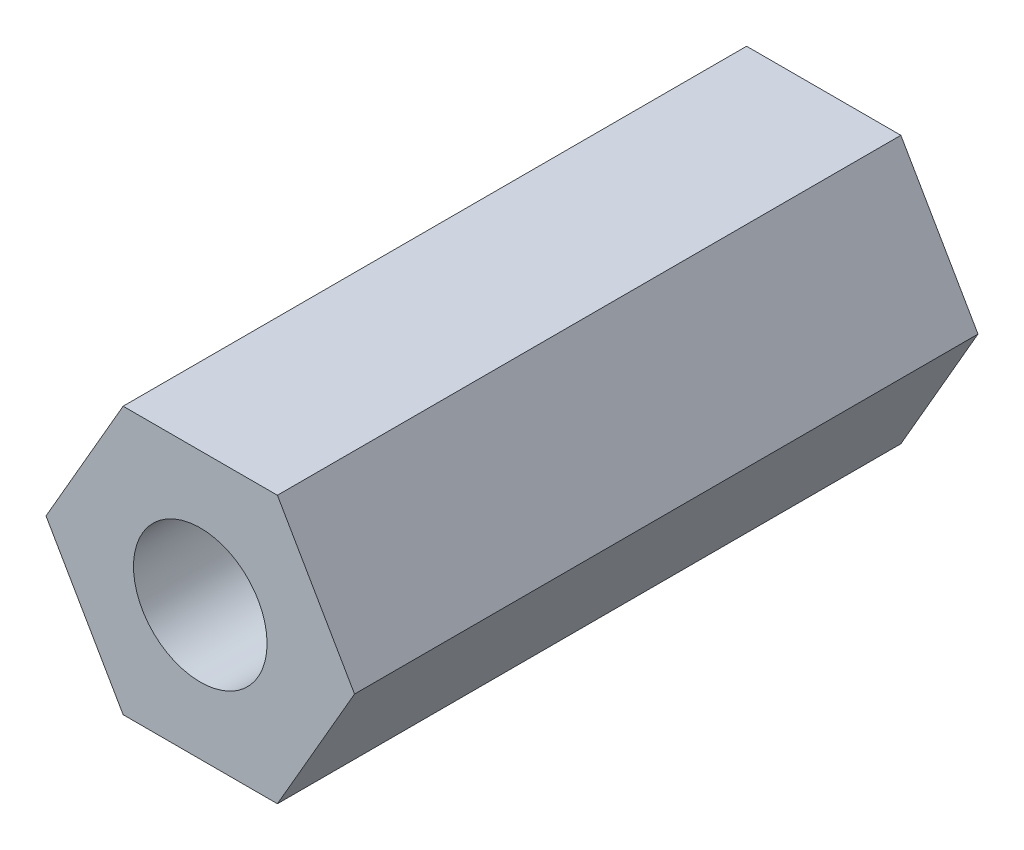
ISO-10303-21;
HEADER;
FILE_DESCRIPTION(('STEP AP214'),'2;1');
FILE_NAME('part.step','',(''),(''),'','','');
FILE_SCHEMA(('AUTOMOTIVE_DESIGN { 1 0 10303 214 1 1 1 1 }'));
ENDSEC;
DATA;
#1=APPLICATION_CONTEXT('core data for automotive mechanical design processes');
#2=APPLICATION_PROTOCOL_DEFINITION('international standard','automotive_design',2000,#1);
#3=PRODUCT_CONTEXT('',#1,'mechanical');
#4=PRODUCT('Part','Part','',(#3));
#5=PRODUCT_RELATED_PRODUCT_CATEGORY('part','',(#4));
#6=PRODUCT_DEFINITION_FORMATION('','',#4);
#7=PRODUCT_DEFINITION_CONTEXT('part definition',#1,'design');
#8=PRODUCT_DEFINITION('design','',#6,#7);
#9=PRODUCT_DEFINITION_SHAPE('','',#8);
#10=(LENGTH_UNIT() NAMED_UNIT(*) SI_UNIT(.MILLI.,.METRE.));
#11=(NAMED_UNIT(*) PLANE_ANGLE_UNIT() SI_UNIT($,.RADIAN.));
#12=(NAMED_UNIT(*) SI_UNIT($,.STERADIAN.) SOLID_ANGLE_UNIT());
#13=UNCERTAINTY_MEASURE_WITH_UNIT(LENGTH_MEASURE(1.E-05),#10,'distance_accuracy_value','');
#14=(GEOMETRIC_REPRESENTATION_CONTEXT(3) GLOBAL_UNCERTAINTY_ASSIGNED_CONTEXT((#13)) GLOBAL_UNIT_ASSIGNED_CONTEXT((#10,
#11,#12)) REPRESENTATION_CONTEXT('',''));
#15=CARTESIAN_POINT('',(0.,0.,0.));
#16=DIRECTION('',(0.,0.,1.));
#17=DIRECTION('',(1.,0.,0.));
#18=AXIS2_PLACEMENT_3D('',#15,#16,#17);
#19=CARTESIAN_POINT('',(-1.73205080756888,-3.,13.));
#20=DIRECTION('',(0.866025403784438,-0.5,0.));
#21=DIRECTION('',(0.5,0.866025403784439,0.));
#22=AXIS2_PLACEMENT_3D('',#19,#20,#21);
#23=PLANE('',#22);
#24=DIRECTION('',(0.,0.,-1.));
#25=VECTOR('',#24,1.);
#26=CARTESIAN_POINT('',(0.,0.,13.));
#27=LINE('',#26,#25);
#28=CARTESIAN_POINT('',(0.,0.,13.));
#29=VERTEX_POINT('',#28);
#30=CARTESIAN_POINT('',(0.,0.,-1.));
#31=VERTEX_POINT('',#30);
#32=EDGE_CURVE('E104',#29,#31,#27,.T.);
#33=ORIENTED_EDGE('',*,*,#32,.T.);
#34=DIRECTION('',(-0.5,-0.866025403784439,0.));
#35=VECTOR('',#34,1.);
#36=CARTESIAN_POINT('',(-1.73205080756888,-3.,-1.));
#37=LINE('',#36,#35);
#38=CARTESIAN_POINT('',(-1.73205080756888,-3.,-1.));
#39=VERTEX_POINT('',#38);
#40=EDGE_CURVE('E98',#31,#39,#37,.T.);
#41=ORIENTED_EDGE('',*,*,#40,.T.);
#42=DIRECTION('',(0.,0.,-1.));
#43=VECTOR('',#42,1.);
#44=CARTESIAN_POINT('',(-1.73205080756888,-3.,13.));
#45=LINE('',#44,#43);
#46=CARTESIAN_POINT('',(-1.73205080756888,-3.,13.));
#47=VERTEX_POINT('',#46);
#48=EDGE_CURVE('E11',#47,#39,#45,.T.);
#49=ORIENTED_EDGE('',*,*,#48,.F.);
#50=DIRECTION('',(-0.5,-0.866025403784439,0.));
#51=VECTOR('',#50,1.);
#52=CARTESIAN_POINT('',(-1.73205080756888,-3.,13.));
#53=LINE('',#52,#51);
#54=EDGE_CURVE('E122',#29,#47,#53,.T.);
#55=ORIENTED_EDGE('',*,*,#54,.F.);
#56=EDGE_LOOP('',(#33,#41,#49,#55));
#57=FACE_BOUND('',#56,.T.);
#58=ADVANCED_FACE('F34',(#57),#23,.F.);
#59=CARTESIAN_POINT('',(0.,-6.,13.));
#60=DIRECTION('',(0.866025403784439,0.5,0.));
#61=DIRECTION('',(-0.5,0.866025403784439,0.));
#62=AXIS2_PLACEMENT_3D('',#59,#60,#61);
#63=PLANE('',#62);
#64=ORIENTED_EDGE('',*,*,#48,.T.);
#65=DIRECTION('',(0.5,-0.866025403784439,0.));
#66=VECTOR('',#65,1.);
#67=CARTESIAN_POINT('',(0.,-6.,-1.));
#68=LINE('',#67,#66);
#69=CARTESIAN_POINT('',(0.,-6.,-1.));
#70=VERTEX_POINT('',#69);
#71=EDGE_CURVE('E88',#39,#70,#68,.T.);
#72=ORIENTED_EDGE('',*,*,#71,.T.);
#73=DIRECTION('',(0.,0.,-1.));
#74=VECTOR('',#73,1.);
#75=CARTESIAN_POINT('',(0.,-6.,13.));
#76=LINE('',#75,#74);
#77=CARTESIAN_POINT('',(0.,-6.,13.));
#78=VERTEX_POINT('',#77);
#79=EDGE_CURVE('E41',#78,#70,#76,.T.);
#80=ORIENTED_EDGE('',*,*,#79,.F.);
#81=DIRECTION('',(0.5,-0.866025403784439,0.));
#82=VECTOR('',#81,1.);
#83=CARTESIAN_POINT('',(0.,-6.,13.));
#84=LINE('',#83,#82);
#85=EDGE_CURVE('E89',#47,#78,#84,.T.);
#86=ORIENTED_EDGE('',*,*,#85,.F.);
#87=EDGE_LOOP('',(#64,#72,#80,#86));
#88=FACE_BOUND('',#87,.T.);
#89=ADVANCED_FACE('F86',(#88),#63,.F.);
#90=CARTESIAN_POINT('',(3.46410161513775,-6.,13.));
#91=DIRECTION('',(0.,1.,0.));
#92=DIRECTION('',(0.,0.,1.));
#93=AXIS2_PLACEMENT_3D('',#90,#91,#92);
#94=PLANE('',#93);
#95=ORIENTED_EDGE('',*,*,#79,.T.);
#96=DIRECTION('',(1.,0.,0.));
#97=VECTOR('',#96,1.);
#98=CARTESIAN_POINT('',(3.46410161513775,-6.,-1.));
#99=LINE('',#98,#97);
#100=CARTESIAN_POINT('',(3.46410161513775,-6.,-1.));
#101=VERTEX_POINT('',#100);
#102=EDGE_CURVE('E102',#70,#101,#99,.T.);
#103=ORIENTED_EDGE('',*,*,#102,.T.);
#104=DIRECTION('',(0.,0.,-1.));
#105=VECTOR('',#104,1.);
#106=CARTESIAN_POINT('',(3.46410161513775,-6.,13.));
#107=LINE('',#106,#105);
#108=CARTESIAN_POINT('',(3.46410161513775,-6.,13.));
#109=VERTEX_POINT('',#108);
#110=EDGE_CURVE('E136',#109,#101,#107,.T.);
#111=ORIENTED_EDGE('',*,*,#110,.F.);
#112=DIRECTION('',(1.,0.,0.));
#113=VECTOR('',#112,1.);
#114=CARTESIAN_POINT('',(3.46410161513775,-6.,13.));
#115=LINE('',#114,#113);
#116=EDGE_CURVE('E125',#78,#109,#115,.T.);
#117=ORIENTED_EDGE('',*,*,#116,.F.);
#118=EDGE_LOOP('',(#95,#103,#111,#117));
#119=FACE_BOUND('',#118,.T.);
#120=ADVANCED_FACE('F139',(#119),#94,.F.);
#121=CARTESIAN_POINT('',(5.19615242270663,-3.,13.));
#122=DIRECTION('',(-0.866025403784439,0.5,0.));
#123=DIRECTION('',(-0.5,-0.866025403784439,0.));
#124=AXIS2_PLACEMENT_3D('',#121,#122,#123);
#125=PLANE('',#124);
#126=ORIENTED_EDGE('',*,*,#110,.T.);
#127=DIRECTION('',(0.5,0.866025403784439,0.));
#128=VECTOR('',#127,1.);
#129=CARTESIAN_POINT('',(5.19615242270663,-3.,-1.));
#130=LINE('',#129,#128);
#131=CARTESIAN_POINT('',(5.19615242270663,-3.,-1.));
#132=VERTEX_POINT('',#131);
#133=EDGE_CURVE('E111',#101,#132,#130,.T.);
#134=ORIENTED_EDGE('',*,*,#133,.T.);
#135=DIRECTION('',(0.,0.,-1.));
#136=VECTOR('',#135,1.);
#137=CARTESIAN_POINT('',(5.19615242270663,-3.,13.));
#138=LINE('',#137,#136);
#139=CARTESIAN_POINT('',(5.19615242270663,-3.,13.));
#140=VERTEX_POINT('',#139);
#141=EDGE_CURVE('E134',#140,#132,#138,.T.);
#142=ORIENTED_EDGE('',*,*,#141,.F.);
#143=DIRECTION('',(0.5,0.866025403784439,0.));
#144=VECTOR('',#143,1.);
#145=CARTESIAN_POINT('',(5.19615242270663,-3.,13.));
#146=LINE('',#145,#144);
#147=EDGE_CURVE('E127',#109,#140,#146,.T.);
#148=ORIENTED_EDGE('',*,*,#147,.F.);
#149=EDGE_LOOP('',(#126,#134,#142,#148));
#150=FACE_BOUND('',#149,.T.);
#151=ADVANCED_FACE('F145',(#150),#125,.F.);
#152=CARTESIAN_POINT('',(3.46410161513775,0.,13.));
#153=DIRECTION('',(-0.866025403784439,-0.5,0.));
#154=DIRECTION('',(0.5,-0.866025403784439,0.));
#155=AXIS2_PLACEMENT_3D('',#152,#153,#154);
#156=PLANE('',#155);
#157=ORIENTED_EDGE('',*,*,#141,.T.);
#158=DIRECTION('',(-0.5,0.866025403784439,0.));
#159=VECTOR('',#158,1.);
#160=CARTESIAN_POINT('',(3.46410161513775,0.,-1.));
#161=LINE('',#160,#159);
#162=CARTESIAN_POINT('',(3.46410161513775,0.,-1.));
#163=VERTEX_POINT('',#162);
#164=EDGE_CURVE('E114',#132,#163,#161,.T.);
#165=ORIENTED_EDGE('',*,*,#164,.T.);
#166=DIRECTION('',(0.,0.,-1.));
#167=VECTOR('',#166,1.);
#168=CARTESIAN_POINT('',(3.46410161513775,0.,13.));
#169=LINE('',#168,#167);
#170=CARTESIAN_POINT('',(3.46410161513775,0.,13.));
#171=VERTEX_POINT('',#170);
#172=EDGE_CURVE('E132',#171,#163,#169,.T.);
#173=ORIENTED_EDGE('',*,*,#172,.F.);
#174=DIRECTION('',(-0.5,0.866025403784439,0.));
#175=VECTOR('',#174,1.);
#176=CARTESIAN_POINT('',(3.46410161513775,0.,13.));
#177=LINE('',#176,#175);
#178=EDGE_CURVE('E53',#140,#171,#177,.T.);
#179=ORIENTED_EDGE('',*,*,#178,.F.);
#180=EDGE_LOOP('',(#157,#165,#173,#179));
#181=FACE_BOUND('',#180,.T.);
#182=ADVANCED_FACE('F148',(#181),#156,.F.);
#183=CARTESIAN_POINT('',(0.,0.,13.));
#184=DIRECTION('',(0.,-1.,0.));
#185=DIRECTION('',(1.,0.,0.));
#186=AXIS2_PLACEMENT_3D('',#183,#184,#185);
#187=PLANE('',#186);
#188=ORIENTED_EDGE('',*,*,#172,.T.);
#189=DIRECTION('',(-1.,0.,0.));
#190=VECTOR('',#189,1.);
#191=CARTESIAN_POINT('',(0.,0.,-1.));
#192=LINE('',#191,#190);
#193=EDGE_CURVE('E117',#163,#31,#192,.T.);
#194=ORIENTED_EDGE('',*,*,#193,.T.);
#195=ORIENTED_EDGE('',*,*,#32,.F.);
#196=DIRECTION('',(-1.,0.,0.));
#197=VECTOR('',#196,1.);
#198=CARTESIAN_POINT('',(0.,0.,13.));
#199=LINE('',#198,#197);
#200=EDGE_CURVE('E48',#171,#29,#199,.T.);
#201=ORIENTED_EDGE('',*,*,#200,.F.);
#202=EDGE_LOOP('',(#188,#194,#195,#201));
#203=FACE_BOUND('',#202,.T.);
#204=ADVANCED_FACE('F150',(#203),#187,.F.);
#205=CARTESIAN_POINT('',(0.,0.,13.));
#206=DIRECTION('',(0.,0.,-1.));
#207=DIRECTION('',(-1.,0.,0.));
#208=AXIS2_PLACEMENT_3D('',#205,#206,#207);
#209=PLANE('',#208);
#210=CARTESIAN_POINT('',(1.73205080756888,-3.,13.));
#211=DIRECTION('',(0.,0.,1.));
#212=DIRECTION('',(1.,0.,0.));
#213=AXIS2_PLACEMENT_3D('',#210,#211,#212);
#214=CIRCLE('',#213,1.5);
#215=CARTESIAN_POINT('',(3.23205080756888,-3.,13.));
#216=VERTEX_POINT('',#215);
#217=EDGE_CURVE('E119',#216,#216,#214,.T.);
#218=ORIENTED_EDGE('',*,*,#217,.F.);
#219=EDGE_LOOP('',(#218));
#220=FACE_BOUND('',#219,.T.);
#221=ORIENTED_EDGE('',*,*,#54,.T.);
#222=ORIENTED_EDGE('',*,*,#85,.T.);
#223=ORIENTED_EDGE('',*,*,#116,.T.);
#224=ORIENTED_EDGE('',*,*,#147,.T.);
#225=ORIENTED_EDGE('',*,*,#178,.T.);
#226=ORIENTED_EDGE('',*,*,#200,.T.);
#227=EDGE_LOOP('',(#221,#222,#223,#224,#225,#226));
#228=FACE_BOUND('',#227,.T.);
#229=ADVANCED_FACE('F142',(#220,#228),#209,.F.);
#230=CARTESIAN_POINT('',(1.73205080756888,-3.,0.));
#231=DIRECTION('',(0.,0.,1.));
#232=DIRECTION('',(1.,0.,0.));
#233=AXIS2_PLACEMENT_3D('',#230,#231,#232);
#234=CYLINDRICAL_SURFACE('',#233,1.5);
#235=CARTESIAN_POINT('',(1.73205080756888,-3.,-1.));
#236=DIRECTION('',(0.,0.,1.));
#237=DIRECTION('',(1.,0.,0.));
#238=AXIS2_PLACEMENT_3D('',#235,#236,#237);
#239=CIRCLE('',#238,1.5);
#240=CARTESIAN_POINT('',(3.23205080756888,-3.,-1.));
#241=VERTEX_POINT('',#240);
#242=EDGE_CURVE('E105',#241,#241,#239,.T.);
#243=CARTESIAN_POINT('',(3.23205080756888,-3.,13.));
#244=CARTESIAN_POINT('',(3.23205080756888,-3.,12.8541666666667));
#245=CARTESIAN_POINT('',(3.23205080756888,-3.,12.7083333333333));
#246=CARTESIAN_POINT('',(3.23205080756888,-3.,12.4166666666667));
#247=CARTESIAN_POINT('',(3.23205080756888,-3.,12.2708333333333));
#248=CARTESIAN_POINT('',(3.23205080756888,-3.,11.9791666666667));
#249=CARTESIAN_POINT('',(3.23205080756888,-3.,11.8333333333333));
#250=CARTESIAN_POINT('',(3.23205080756888,-3.,11.5416666666667));
#251=CARTESIAN_POINT('',(3.23205080756888,-3.,11.3958333333333));
#252=CARTESIAN_POINT('',(3.23205080756888,-3.,11.1041666666667));
#253=CARTESIAN_POINT('',(3.23205080756888,-3.,10.9583333333333));
#254=CARTESIAN_POINT('',(3.23205080756888,-3.,10.6666666666667));
#255=CARTESIAN_POINT('',(3.23205080756888,-3.,10.5208333333333));
#256=CARTESIAN_POINT('',(3.23205080756888,-3.,10.2291666666667));
#257=CARTESIAN_POINT('',(3.23205080756888,-3.,10.0833333333333));
#258=CARTESIAN_POINT('',(3.23205080756888,-3.,9.79166666666667));
#259=CARTESIAN_POINT('',(3.23205080756888,-3.,9.64583333333333));
#260=CARTESIAN_POINT('',(3.23205080756888,-3.,9.35416666666667));
#261=CARTESIAN_POINT('',(3.23205080756888,-3.,9.20833333333333));
#262=CARTESIAN_POINT('',(3.23205080756888,-3.,8.91666666666667));
#263=CARTESIAN_POINT('',(3.23205080756888,-3.,8.77083333333333));
#264=CARTESIAN_POINT('',(3.23205080756888,-3.,8.47916666666667));
#265=CARTESIAN_POINT('',(3.23205080756888,-3.,8.33333333333333));
#266=CARTESIAN_POINT('',(3.23205080756888,-3.,8.04166666666667));
#267=CARTESIAN_POINT('',(3.23205080756888,-3.,7.89583333333333));
#268=CARTESIAN_POINT('',(3.23205080756888,-3.,7.60416666666667));
#269=CARTESIAN_POINT('',(3.23205080756888,-3.,7.45833333333333));
#270=CARTESIAN_POINT('',(3.23205080756888,-3.,7.16666666666667));
#271=CARTESIAN_POINT('',(3.23205080756888,-3.,7.02083333333333));
#272=CARTESIAN_POINT('',(3.23205080756888,-3.,6.72916666666667));
#273=CARTESIAN_POINT('',(3.23205080756888,-3.,6.58333333333333));
#274=CARTESIAN_POINT('',(3.23205080756888,-3.,6.29166666666667));
#275=CARTESIAN_POINT('',(3.23205080756888,-3.,6.14583333333333));
#276=CARTESIAN_POINT('',(3.23205080756888,-3.,5.85416666666667));
#277=CARTESIAN_POINT('',(3.23205080756888,-3.,5.70833333333333));
#278=CARTESIAN_POINT('',(3.23205080756888,-3.,5.41666666666667));
#279=CARTESIAN_POINT('',(3.23205080756888,-3.,5.27083333333333));
#280=CARTESIAN_POINT('',(3.23205080756888,-3.,4.97916666666667));
#281=CARTESIAN_POINT('',(3.23205080756888,-3.,4.83333333333333));
#282=CARTESIAN_POINT('',(3.23205080756888,-3.,4.54166666666667));
#283=CARTESIAN_POINT('',(3.23205080756888,-3.,4.39583333333333));
#284=CARTESIAN_POINT('',(3.23205080756888,-3.,4.10416666666667));
#285=CARTESIAN_POINT('',(3.23205080756888,-3.,3.95833333333333));
#286=CARTESIAN_POINT('',(3.23205080756888,-3.,3.66666666666667));
#287=CARTESIAN_POINT('',(3.23205080756888,-3.,3.52083333333333));
#288=CARTESIAN_POINT('',(3.23205080756888,-3.,3.22916666666667));
#289=CARTESIAN_POINT('',(3.23205080756888,-3.,3.08333333333333));
#290=CARTESIAN_POINT('',(3.23205080756888,-3.,2.79166666666667));
#291=CARTESIAN_POINT('',(3.23205080756888,-3.,2.64583333333333));
#292=CARTESIAN_POINT('',(3.23205080756888,-3.,2.35416666666667));
#293=CARTESIAN_POINT('',(3.23205080756888,-3.,2.20833333333333));
#294=CARTESIAN_POINT('',(3.23205080756888,-3.,1.91666666666667));
#295=CARTESIAN_POINT('',(3.23205080756888,-3.,1.77083333333333));
#296=CARTESIAN_POINT('',(3.23205080756888,-3.,1.47916666666667));
#297=CARTESIAN_POINT('',(3.23205080756888,-3.,1.33333333333333));
#298=CARTESIAN_POINT('',(3.23205080756888,-3.,1.04166666666667));
#299=CARTESIAN_POINT('',(3.23205080756888,-3.,0.895833333333332));
#300=CARTESIAN_POINT('',(3.23205080756888,-3.,0.604166666666665));
#301=CARTESIAN_POINT('',(3.23205080756888,-3.,0.458333333333332));
#302=CARTESIAN_POINT('',(3.23205080756888,-3.,0.166666666666666));
#303=CARTESIAN_POINT('',(3.23205080756888,-3.,0.0208333333333327));
#304=CARTESIAN_POINT('',(3.23205080756888,-3.,-0.270833333333333));
#305=CARTESIAN_POINT('',(3.23205080756888,-3.,-0.416666666666667));
#306=CARTESIAN_POINT('',(3.23205080756888,-3.,-0.708333333333334));
#307=CARTESIAN_POINT('',(3.23205080756888,-3.,-0.854166666666667));
#308=CARTESIAN_POINT('',(3.23205080756888,-3.,-1.));
#309=B_SPLINE_CURVE_WITH_KNOTS('',3,(#243,#244,#245,#246,#247,#248,#249,#250,#251,#252,#253,
#254,#255,#256,#257,#258,#259,#260,#261,#262,#263,#264,#265,#266,#267,#268,#269,#270,#271,#272,
#273,#274,#275,#276,#277,#278,#279,#280,#281,#282,#283,#284,#285,#286,#287,#288,#289,#290,#291,
#292,#293,#294,#295,#296,#297,#298,#299,#300,#301,#302,#303,#304,#305,#306,#307,#308),
.UNSPECIFIED.,.F.,.F.,(4,2,2,2,2,2,2,2,2,2,2,2,2,2,2,2,2,2,2,2,2,2,2,2,2,2,2,2,2,2,2,2,4),(0.,
0.4375,0.875000000000001,1.3125,1.75,2.1875,2.625,3.0625,3.5,3.9375,4.375,4.8125,5.25,5.6875,
6.125,6.5625,7.,7.4375,7.875,8.3125,8.75,9.1875,9.625,10.0625,10.5,10.9375,11.375,11.8125,12.25,
12.6875,13.125,13.5625,14.),.UNSPECIFIED.);
#310=EDGE_CURVE('BSEAM157',#216,#241,#309,.T.);
#311=ORIENTED_EDGE('',*,*,#217,.T.);
#312=ORIENTED_EDGE('',*,*,#242,.F.);
#313=ORIENTED_EDGE('',*,*,#310,.T.);
#314=ORIENTED_EDGE('',*,*,#310,.F.);
#315=EDGE_LOOP('',(#311,#313,#312,#314));
#316=FACE_BOUND('',#315,.T.);
#317=ADVANCED_FACE('F157',(#316),#234,.F.);
#318=CARTESIAN_POINT('',(0.,0.,-1.));
#319=DIRECTION('',(0.,0.,-1.));
#320=DIRECTION('',(-1.,0.,0.));
#321=AXIS2_PLACEMENT_3D('',#318,#319,#320);
#322=PLANE('',#321);
#323=ORIENTED_EDGE('',*,*,#242,.T.);
#324=EDGE_LOOP('',(#323));
#325=FACE_BOUND('',#324,.T.);
#326=ORIENTED_EDGE('',*,*,#40,.F.);
#327=ORIENTED_EDGE('',*,*,#193,.F.);
#328=ORIENTED_EDGE('',*,*,#164,.F.);
#329=ORIENTED_EDGE('',*,*,#133,.F.);
#330=ORIENTED_EDGE('',*,*,#102,.F.);
#331=ORIENTED_EDGE('',*,*,#71,.F.);
#332=EDGE_LOOP('',(#326,#327,#328,#329,#330,#331));
#333=FACE_BOUND('',#332,.T.);
#334=ADVANCED_FACE('F96',(#325,#333),#322,.T.);
#335=CLOSED_SHELL('',(#58,#89,#120,#151,#182,#204,#229,#317,#334));
#336=MANIFOLD_SOLID_BREP('B2',#335);
#337=ADVANCED_BREP_SHAPE_REPRESENTATION('',(#18,#336),#14);
#338=SHAPE_DEFINITION_REPRESENTATION(#9,#337);
ENDSEC;
END-ISO-10303-21;
